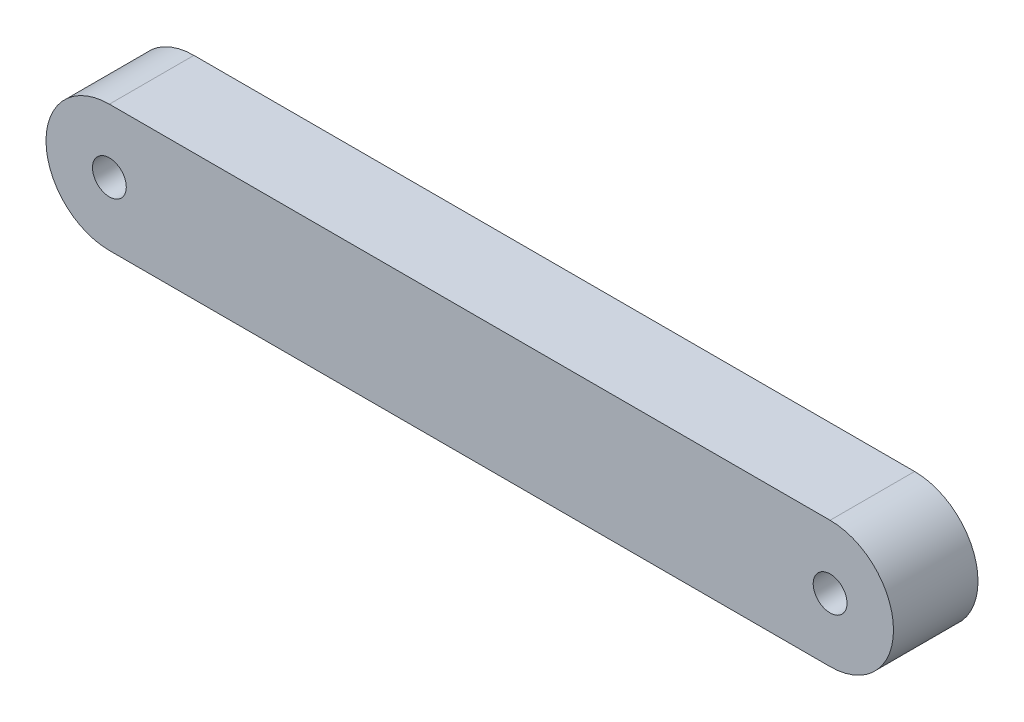
ISO-10303-21;
HEADER;
FILE_DESCRIPTION(('STEP AP214'),'2;1');
FILE_NAME('part.step','',(''),(''),'','','');
FILE_SCHEMA(('AUTOMOTIVE_DESIGN { 1 0 10303 214 1 1 1 1 }'));
ENDSEC;
DATA;
#1=APPLICATION_CONTEXT('core data for automotive mechanical design processes');
#2=APPLICATION_PROTOCOL_DEFINITION('international standard','automotive_design',2000,#1);
#3=PRODUCT_CONTEXT('',#1,'mechanical');
#4=PRODUCT('Part','Part','',(#3));
#5=PRODUCT_RELATED_PRODUCT_CATEGORY('part','',(#4));
#6=PRODUCT_DEFINITION_FORMATION('','',#4);
#7=PRODUCT_DEFINITION_CONTEXT('part definition',#1,'design');
#8=PRODUCT_DEFINITION('design','',#6,#7);
#9=PRODUCT_DEFINITION_SHAPE('','',#8);
#10=(LENGTH_UNIT() NAMED_UNIT(*) SI_UNIT(.MILLI.,.METRE.));
#11=(NAMED_UNIT(*) PLANE_ANGLE_UNIT() SI_UNIT($,.RADIAN.));
#12=(NAMED_UNIT(*) SI_UNIT($,.STERADIAN.) SOLID_ANGLE_UNIT());
#13=UNCERTAINTY_MEASURE_WITH_UNIT(LENGTH_MEASURE(1.E-05),#10,'distance_accuracy_value','');
#14=(GEOMETRIC_REPRESENTATION_CONTEXT(3) GLOBAL_UNCERTAINTY_ASSIGNED_CONTEXT((#13)) GLOBAL_UNIT_ASSIGNED_CONTEXT((#10,
#11,#12)) REPRESENTATION_CONTEXT('',''));
#15=CARTESIAN_POINT('',(0.,0.,0.));
#16=DIRECTION('',(0.,0.,1.));
#17=DIRECTION('',(1.,0.,0.));
#18=AXIS2_PLACEMENT_3D('',#15,#16,#17);
#19=CARTESIAN_POINT('',(0.,0.,20.));
#20=DIRECTION('',(0.,0.,1.));
#21=DIRECTION('',(1.,0.,0.));
#22=AXIS2_PLACEMENT_3D('',#19,#20,#21);
#23=PLANE('',#22);
#24=CARTESIAN_POINT('',(0.,0.,20.));
#25=DIRECTION('',(0.,0.,1.));
#26=DIRECTION('',(1.,0.,0.));
#27=AXIS2_PLACEMENT_3D('',#24,#25,#26);
#28=CIRCLE('',#27,4.);
#29=CARTESIAN_POINT('',(4.,0.,20.));
#30=VERTEX_POINT('',#29);
#31=EDGE_CURVE('E118',#30,#30,#28,.T.);
#32=ORIENTED_EDGE('',*,*,#31,.F.);
#33=EDGE_LOOP('',(#32));
#34=FACE_BOUND('',#33,.T.);
#35=CARTESIAN_POINT('',(0.,0.,20.));
#36=DIRECTION('',(0.,0.,1.));
#37=DIRECTION('',(1.,0.,0.));
#38=AXIS2_PLACEMENT_3D('',#35,#36,#37);
#39=CIRCLE('',#38,15.);
#40=CARTESIAN_POINT('',(0.,15.,20.));
#41=VERTEX_POINT('',#40);
#42=CARTESIAN_POINT('',(0.,-15.,20.));
#43=VERTEX_POINT('',#42);
#44=EDGE_CURVE('E98',#41,#43,#39,.T.);
#45=ORIENTED_EDGE('',*,*,#44,.T.);
#46=DIRECTION('',(1.,0.,0.));
#47=VECTOR('',#46,1.);
#48=CARTESIAN_POINT('',(0.,-15.,20.));
#49=LINE('',#48,#47);
#50=CARTESIAN_POINT('',(170.56,-15.,20.));
#51=VERTEX_POINT('',#50);
#52=EDGE_CURVE('E93',#43,#51,#49,.T.);
#53=ORIENTED_EDGE('',*,*,#52,.T.);
#54=CARTESIAN_POINT('',(170.56,0.,20.));
#55=DIRECTION('',(0.,0.,1.));
#56=DIRECTION('',(1.,0.,0.));
#57=AXIS2_PLACEMENT_3D('',#54,#55,#56);
#58=CIRCLE('',#57,15.);
#59=CARTESIAN_POINT('',(170.56,15.,20.));
#60=VERTEX_POINT('',#59);
#61=EDGE_CURVE('E96',#51,#60,#58,.T.);
#62=ORIENTED_EDGE('',*,*,#61,.T.);
#63=DIRECTION('',(-1.,0.,0.));
#64=VECTOR('',#63,1.);
#65=CARTESIAN_POINT('',(0.,15.,20.));
#66=LINE('',#65,#64);
#67=EDGE_CURVE('E63',#60,#41,#66,.T.);
#68=ORIENTED_EDGE('',*,*,#67,.T.);
#69=EDGE_LOOP('',(#45,#53,#62,#68));
#70=FACE_BOUND('',#69,.T.);
#71=CARTESIAN_POINT('',(170.56,0.,20.));
#72=DIRECTION('',(0.,0.,1.));
#73=DIRECTION('',(1.,0.,0.));
#74=AXIS2_PLACEMENT_3D('',#71,#72,#73);
#75=CIRCLE('',#74,3.99999999999999);
#76=CARTESIAN_POINT('',(174.56,0.,20.));
#77=VERTEX_POINT('',#76);
#78=EDGE_CURVE('E140',#77,#77,#75,.T.);
#79=ORIENTED_EDGE('',*,*,#78,.F.);
#80=EDGE_LOOP('',(#79));
#81=FACE_BOUND('',#80,.T.);
#82=ADVANCED_FACE('F45',(#34,#70,#81),#23,.T.);
#83=CARTESIAN_POINT('',(0.,0.,0.));
#84=DIRECTION('',(0.,0.,1.));
#85=DIRECTION('',(1.,0.,0.));
#86=AXIS2_PLACEMENT_3D('',#83,#84,#85);
#87=PLANE('',#86);
#88=CARTESIAN_POINT('',(0.,0.,0.));
#89=DIRECTION('',(0.,0.,1.));
#90=DIRECTION('',(1.,0.,0.));
#91=AXIS2_PLACEMENT_3D('',#88,#89,#90);
#92=CIRCLE('',#91,15.);
#93=CARTESIAN_POINT('',(0.,15.,0.));
#94=VERTEX_POINT('',#93);
#95=CARTESIAN_POINT('',(0.,-15.,0.));
#96=VERTEX_POINT('',#95);
#97=EDGE_CURVE('E114',#94,#96,#92,.T.);
#98=ORIENTED_EDGE('',*,*,#97,.F.);
#99=DIRECTION('',(-1.,0.,0.));
#100=VECTOR('',#99,1.);
#101=CARTESIAN_POINT('',(0.,15.,0.));
#102=LINE('',#101,#100);
#103=CARTESIAN_POINT('',(170.56,15.,0.));
#104=VERTEX_POINT('',#103);
#105=EDGE_CURVE('E86',#104,#94,#102,.T.);
#106=ORIENTED_EDGE('',*,*,#105,.F.);
#107=CARTESIAN_POINT('',(170.56,0.,0.));
#108=DIRECTION('',(0.,0.,1.));
#109=DIRECTION('',(1.,0.,0.));
#110=AXIS2_PLACEMENT_3D('',#107,#108,#109);
#111=CIRCLE('',#110,15.);
#112=CARTESIAN_POINT('',(170.56,-15.,0.));
#113=VERTEX_POINT('',#112);
#114=EDGE_CURVE('E80',#113,#104,#111,.T.);
#115=ORIENTED_EDGE('',*,*,#114,.F.);
#116=DIRECTION('',(1.,0.,0.));
#117=VECTOR('',#116,1.);
#118=CARTESIAN_POINT('',(0.,-15.,0.));
#119=LINE('',#118,#117);
#120=EDGE_CURVE('E103',#96,#113,#119,.T.);
#121=ORIENTED_EDGE('',*,*,#120,.F.);
#122=EDGE_LOOP('',(#98,#106,#115,#121));
#123=FACE_BOUND('',#122,.T.);
#124=CARTESIAN_POINT('',(0.,0.,0.));
#125=DIRECTION('',(0.,0.,1.));
#126=DIRECTION('',(1.,0.,0.));
#127=AXIS2_PLACEMENT_3D('',#124,#125,#126);
#128=CIRCLE('',#127,4.);
#129=CARTESIAN_POINT('',(4.,0.,0.));
#130=VERTEX_POINT('',#129);
#131=EDGE_CURVE('E136',#130,#130,#128,.T.);
#132=ORIENTED_EDGE('',*,*,#131,.T.);
#133=EDGE_LOOP('',(#132));
#134=FACE_BOUND('',#133,.T.);
#135=CARTESIAN_POINT('',(170.56,0.,0.));
#136=DIRECTION('',(0.,0.,1.));
#137=DIRECTION('',(1.,0.,0.));
#138=AXIS2_PLACEMENT_3D('',#135,#136,#137);
#139=CIRCLE('',#138,3.99999999999999);
#140=CARTESIAN_POINT('',(174.56,0.,0.));
#141=VERTEX_POINT('',#140);
#142=EDGE_CURVE('E144',#141,#141,#139,.T.);
#143=ORIENTED_EDGE('',*,*,#142,.T.);
#144=EDGE_LOOP('',(#143));
#145=FACE_BOUND('',#144,.T.);
#146=ADVANCED_FACE('F131',(#123,#134,#145),#87,.F.);
#147=CARTESIAN_POINT('',(0.,0.,20.));
#148=DIRECTION('',(0.,0.,-1.));
#149=DIRECTION('',(-1.,0.,0.));
#150=AXIS2_PLACEMENT_3D('',#147,#148,#149);
#151=CYLINDRICAL_SURFACE('',#150,15.);
#152=ORIENTED_EDGE('',*,*,#97,.T.);
#153=DIRECTION('',(0.,0.,-1.));
#154=VECTOR('',#153,1.);
#155=CARTESIAN_POINT('',(0.,-15.,20.));
#156=LINE('',#155,#154);
#157=EDGE_CURVE('E11',#43,#96,#156,.T.);
#158=ORIENTED_EDGE('',*,*,#157,.F.);
#159=ORIENTED_EDGE('',*,*,#44,.F.);
#160=DIRECTION('',(0.,0.,-1.));
#161=VECTOR('',#160,1.);
#162=CARTESIAN_POINT('',(0.,15.,20.));
#163=LINE('',#162,#161);
#164=EDGE_CURVE('E110',#41,#94,#163,.T.);
#165=ORIENTED_EDGE('',*,*,#164,.T.);
#166=EDGE_LOOP('',(#152,#158,#159,#165));
#167=FACE_BOUND('',#166,.T.);
#168=ADVANCED_FACE('F47',(#167),#151,.T.);
#169=CARTESIAN_POINT('',(0.,-15.,20.));
#170=DIRECTION('',(0.,1.,0.));
#171=DIRECTION('',(-1.,0.,0.));
#172=AXIS2_PLACEMENT_3D('',#169,#170,#171);
#173=PLANE('',#172);
#174=ORIENTED_EDGE('',*,*,#120,.T.);
#175=DIRECTION('',(0.,0.,-1.));
#176=VECTOR('',#175,1.);
#177=CARTESIAN_POINT('',(170.56,-15.,20.));
#178=LINE('',#177,#176);
#179=EDGE_CURVE('E55',#51,#113,#178,.T.);
#180=ORIENTED_EDGE('',*,*,#179,.F.);
#181=ORIENTED_EDGE('',*,*,#52,.F.);
#182=ORIENTED_EDGE('',*,*,#157,.T.);
#183=EDGE_LOOP('',(#174,#180,#181,#182));
#184=FACE_BOUND('',#183,.T.);
#185=ADVANCED_FACE('F102',(#184),#173,.F.);
#186=CARTESIAN_POINT('',(170.56,0.,20.));
#187=DIRECTION('',(0.,0.,-1.));
#188=DIRECTION('',(-1.,0.,0.));
#189=AXIS2_PLACEMENT_3D('',#186,#187,#188);
#190=CYLINDRICAL_SURFACE('',#189,15.);
#191=ORIENTED_EDGE('',*,*,#114,.T.);
#192=DIRECTION('',(0.,0.,-1.));
#193=VECTOR('',#192,1.);
#194=CARTESIAN_POINT('',(170.56,15.,20.));
#195=LINE('',#194,#193);
#196=EDGE_CURVE('E105',#60,#104,#195,.T.);
#197=ORIENTED_EDGE('',*,*,#196,.F.);
#198=ORIENTED_EDGE('',*,*,#61,.F.);
#199=ORIENTED_EDGE('',*,*,#179,.T.);
#200=EDGE_LOOP('',(#191,#197,#198,#199));
#201=FACE_BOUND('',#200,.T.);
#202=ADVANCED_FACE('F106',(#201),#190,.T.);
#203=CARTESIAN_POINT('',(0.,15.,20.));
#204=DIRECTION('',(0.,-1.,0.));
#205=DIRECTION('',(1.,0.,0.));
#206=AXIS2_PLACEMENT_3D('',#203,#204,#205);
#207=PLANE('',#206);
#208=ORIENTED_EDGE('',*,*,#105,.T.);
#209=ORIENTED_EDGE('',*,*,#164,.F.);
#210=ORIENTED_EDGE('',*,*,#67,.F.);
#211=ORIENTED_EDGE('',*,*,#196,.T.);
#212=EDGE_LOOP('',(#208,#209,#210,#211));
#213=FACE_BOUND('',#212,.T.);
#214=ADVANCED_FACE('F128',(#213),#207,.F.);
#215=CARTESIAN_POINT('',(0.,0.,20.));
#216=DIRECTION('',(0.,0.,-1.));
#217=DIRECTION('',(-1.,0.,0.));
#218=AXIS2_PLACEMENT_3D('',#215,#216,#217);
#219=CYLINDRICAL_SURFACE('',#218,4.);
#220=ORIENTED_EDGE('',*,*,#31,.T.);
#221=EDGE_LOOP('',(#220));
#222=FACE_BOUND('',#221,.T.);
#223=ORIENTED_EDGE('',*,*,#131,.F.);
#224=EDGE_LOOP('',(#223));
#225=FACE_BOUND('',#224,.T.);
#226=ADVANCED_FACE('F163',(#222,#225),#219,.F.);
#227=CARTESIAN_POINT('',(170.56,0.,20.));
#228=DIRECTION('',(0.,0.,-1.));
#229=DIRECTION('',(-1.,0.,0.));
#230=AXIS2_PLACEMENT_3D('',#227,#228,#229);
#231=CYLINDRICAL_SURFACE('',#230,3.99999999999999);
#232=ORIENTED_EDGE('',*,*,#78,.T.);
#233=EDGE_LOOP('',(#232));
#234=FACE_BOUND('',#233,.T.);
#235=ORIENTED_EDGE('',*,*,#142,.F.);
#236=EDGE_LOOP('',(#235));
#237=FACE_BOUND('',#236,.T.);
#238=ADVANCED_FACE('F152',(#234,#237),#231,.F.);
#239=CLOSED_SHELL('',(#82,#146,#168,#185,#202,#214,#226,#238));
#240=MANIFOLD_SOLID_BREP('B2',#239);
#241=ADVANCED_BREP_SHAPE_REPRESENTATION('',(#18,#240),#14);
#242=SHAPE_DEFINITION_REPRESENTATION(#9,#241);
ENDSEC;
END-ISO-10303-21;
